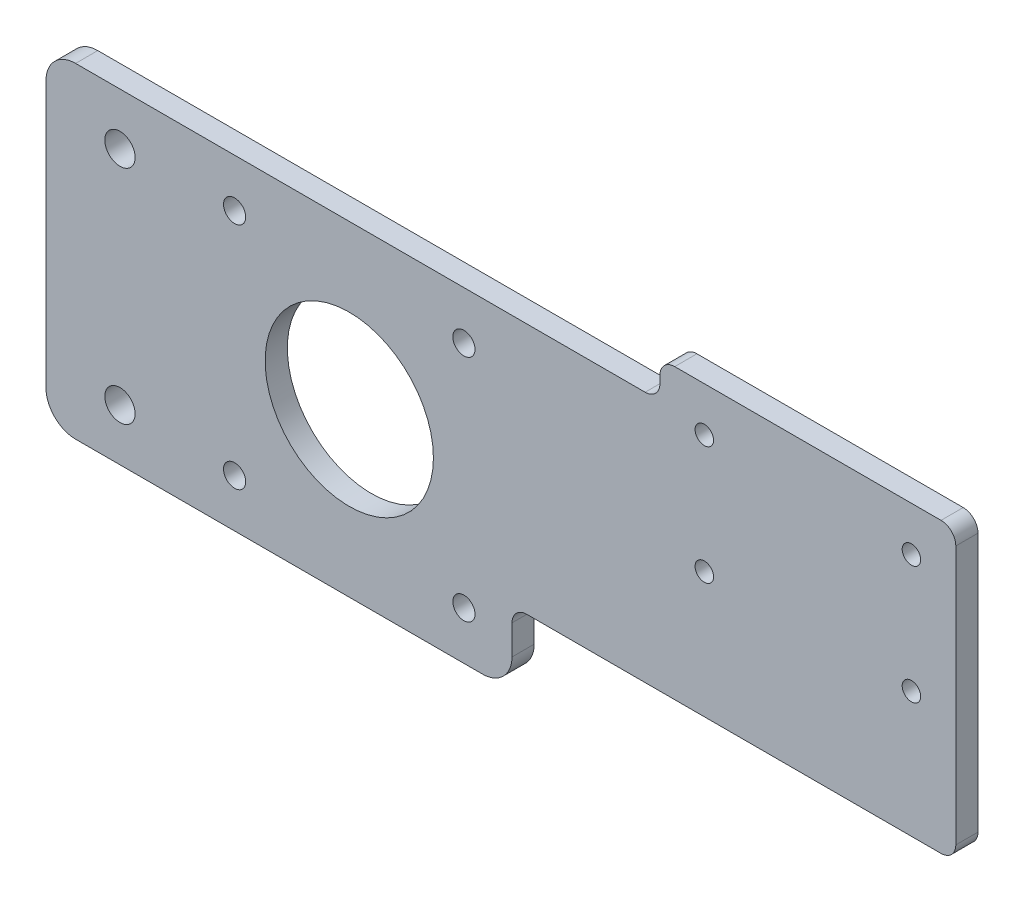
ISO-10303-21;
HEADER;
FILE_DESCRIPTION(('STEP AP214'),'2;1');
FILE_NAME('part.step','',(''),(''),'','','');
FILE_SCHEMA(('AUTOMOTIVE_DESIGN { 1 0 10303 214 1 1 1 1 }'));
ENDSEC;
DATA;
#1=APPLICATION_CONTEXT('core data for automotive mechanical design processes');
#2=APPLICATION_PROTOCOL_DEFINITION('international standard','automotive_design',2000,#1);
#3=PRODUCT_CONTEXT('',#1,'mechanical');
#4=PRODUCT('Part','Part','',(#3));
#5=PRODUCT_RELATED_PRODUCT_CATEGORY('part','',(#4));
#6=PRODUCT_DEFINITION_FORMATION('','',#4);
#7=PRODUCT_DEFINITION_CONTEXT('part definition',#1,'design');
#8=PRODUCT_DEFINITION('design','',#6,#7);
#9=PRODUCT_DEFINITION_SHAPE('','',#8);
#10=(LENGTH_UNIT() NAMED_UNIT(*) SI_UNIT(.MILLI.,.METRE.));
#11=(NAMED_UNIT(*) PLANE_ANGLE_UNIT() SI_UNIT($,.RADIAN.));
#12=(NAMED_UNIT(*) SI_UNIT($,.STERADIAN.) SOLID_ANGLE_UNIT());
#13=UNCERTAINTY_MEASURE_WITH_UNIT(LENGTH_MEASURE(1.E-05),#10,'distance_accuracy_value','');
#14=(GEOMETRIC_REPRESENTATION_CONTEXT(3) GLOBAL_UNCERTAINTY_ASSIGNED_CONTEXT((#13)) GLOBAL_UNIT_ASSIGNED_CONTEXT((#10,
#11,#12)) REPRESENTATION_CONTEXT('',''));
#15=CARTESIAN_POINT('',(0.,0.,0.));
#16=DIRECTION('',(0.,0.,1.));
#17=DIRECTION('',(1.,0.,0.));
#18=AXIS2_PLACEMENT_3D('',#15,#16,#17);
#19=CARTESIAN_POINT('',(31.5,22.,1.5));
#20=DIRECTION('',(-1.,0.,0.));
#21=DIRECTION('',(0.,0.,1.));
#22=AXIS2_PLACEMENT_3D('',#19,#20,#21);
#23=PLANE('',#22);
#24=DIRECTION('',(0.,1.,0.));
#25=VECTOR('',#24,1.);
#26=CARTESIAN_POINT('',(31.5,22.,-1.5));
#27=LINE('',#26,#25);
#28=CARTESIAN_POINT('',(31.5,-18.,-1.5));
#29=VERTEX_POINT('',#28);
#30=CARTESIAN_POINT('',(31.5,-14.,-1.5));
#31=VERTEX_POINT('',#30);
#32=EDGE_CURVE('E163',#29,#31,#27,.T.);
#33=ORIENTED_EDGE('',*,*,#32,.T.);
#34=DIRECTION('',(0.,0.,1.));
#35=VECTOR('',#34,1.);
#36=CARTESIAN_POINT('',(31.5,-14.,1.5));
#37=LINE('',#36,#35);
#38=CARTESIAN_POINT('',(31.5,-14.,1.5));
#39=VERTEX_POINT('',#38);
#40=EDGE_CURVE('E244',#31,#39,#37,.T.);
#41=ORIENTED_EDGE('',*,*,#40,.T.);
#42=DIRECTION('',(0.,1.,0.));
#43=VECTOR('',#42,1.);
#44=CARTESIAN_POINT('',(31.5,22.,1.5));
#45=LINE('',#44,#43);
#46=CARTESIAN_POINT('',(31.5,-18.,1.5));
#47=VERTEX_POINT('',#46);
#48=EDGE_CURVE('E166',#47,#39,#45,.T.);
#49=ORIENTED_EDGE('',*,*,#48,.F.);
#50=DIRECTION('',(0.,0.,-1.));
#51=VECTOR('',#50,1.);
#52=CARTESIAN_POINT('',(31.5,-18.,1.5));
#53=LINE('',#52,#51);
#54=EDGE_CURVE('E151',#47,#29,#53,.T.);
#55=ORIENTED_EDGE('',*,*,#54,.T.);
#56=EDGE_LOOP('',(#33,#41,#49,#55));
#57=FACE_BOUND('',#56,.T.);
#58=ADVANCED_FACE('F33',(#57),#23,.F.);
#59=CARTESIAN_POINT('',(-31.5,22.,1.5));
#60=DIRECTION('',(0.,-1.,0.));
#61=DIRECTION('',(0.,0.,-1.));
#62=AXIS2_PLACEMENT_3D('',#59,#60,#61);
#63=PLANE('',#62);
#64=DIRECTION('',(-1.,0.,0.));
#65=VECTOR('',#64,1.);
#66=CARTESIAN_POINT('',(-31.5,22.,1.5));
#67=LINE('',#66,#65);
#68=CARTESIAN_POINT('',(49.5,22.,1.5));
#69=VERTEX_POINT('',#68);
#70=CARTESIAN_POINT('',(-27.5,22.,1.5));
#71=VERTEX_POINT('',#70);
#72=EDGE_CURVE('E330',#69,#71,#67,.T.);
#73=ORIENTED_EDGE('',*,*,#72,.F.);
#74=DIRECTION('',(0.,0.,1.));
#75=VECTOR('',#74,1.);
#76=CARTESIAN_POINT('',(49.5,22.,1.5));
#77=LINE('',#76,#75);
#78=CARTESIAN_POINT('',(49.5,22.,-1.5));
#79=VERTEX_POINT('',#78);
#80=EDGE_CURVE('E238',#69,#79,#77,.F.);
#81=ORIENTED_EDGE('',*,*,#80,.T.);
#82=DIRECTION('',(-1.,0.,0.));
#83=VECTOR('',#82,1.);
#84=CARTESIAN_POINT('',(-31.5,22.,-1.5));
#85=LINE('',#84,#83);
#86=CARTESIAN_POINT('',(-27.5,22.,-1.5));
#87=VERTEX_POINT('',#86);
#88=EDGE_CURVE('E173',#79,#87,#85,.T.);
#89=ORIENTED_EDGE('',*,*,#88,.T.);
#90=DIRECTION('',(0.,0.,-1.));
#91=VECTOR('',#90,1.);
#92=CARTESIAN_POINT('',(-27.5,22.,1.5));
#93=LINE('',#92,#91);
#94=EDGE_CURVE('E204',#87,#71,#93,.F.);
#95=ORIENTED_EDGE('',*,*,#94,.T.);
#96=EDGE_LOOP('',(#73,#81,#89,#95));
#97=FACE_BOUND('',#96,.T.);
#98=ADVANCED_FACE('F268',(#97),#63,.F.);
#99=CARTESIAN_POINT('',(-31.5,22.,1.5));
#100=DIRECTION('',(1.,0.,0.));
#101=DIRECTION('',(0.,0.,-1.));
#102=AXIS2_PLACEMENT_3D('',#99,#100,#101);
#103=PLANE('',#102);
#104=DIRECTION('',(0.,-1.,0.));
#105=VECTOR('',#104,1.);
#106=CARTESIAN_POINT('',(-31.5,22.,-1.5));
#107=LINE('',#106,#105);
#108=CARTESIAN_POINT('',(-31.5,18.,-1.5));
#109=VERTEX_POINT('',#108);
#110=CARTESIAN_POINT('',(-31.5,-18.,-1.5));
#111=VERTEX_POINT('',#110);
#112=EDGE_CURVE('E176',#109,#111,#107,.T.);
#113=ORIENTED_EDGE('',*,*,#112,.T.);
#114=DIRECTION('',(0.,0.,-1.));
#115=VECTOR('',#114,1.);
#116=CARTESIAN_POINT('',(-31.5,-18.,1.5));
#117=LINE('',#116,#115);
#118=CARTESIAN_POINT('',(-31.5,-18.,1.5));
#119=VERTEX_POINT('',#118);
#120=EDGE_CURVE('E202',#111,#119,#117,.F.);
#121=ORIENTED_EDGE('',*,*,#120,.T.);
#122=DIRECTION('',(0.,-1.,0.));
#123=VECTOR('',#122,1.);
#124=CARTESIAN_POINT('',(-31.5,22.,1.5));
#125=LINE('',#124,#123);
#126=CARTESIAN_POINT('',(-31.5,18.,1.5));
#127=VERTEX_POINT('',#126);
#128=EDGE_CURVE('E331',#127,#119,#125,.T.);
#129=ORIENTED_EDGE('',*,*,#128,.F.);
#130=DIRECTION('',(0.,0.,-1.));
#131=VECTOR('',#130,1.);
#132=CARTESIAN_POINT('',(-31.5,18.,1.5));
#133=LINE('',#132,#131);
#134=EDGE_CURVE('E199',#127,#109,#133,.T.);
#135=ORIENTED_EDGE('',*,*,#134,.T.);
#136=EDGE_LOOP('',(#113,#121,#129,#135));
#137=FACE_BOUND('',#136,.T.);
#138=ADVANCED_FACE('F275',(#137),#103,.F.);
#139=CARTESIAN_POINT('',(-31.5,-22.,1.5));
#140=DIRECTION('',(0.,1.,0.));
#141=DIRECTION('',(0.,0.,1.));
#142=AXIS2_PLACEMENT_3D('',#139,#140,#141);
#143=PLANE('',#142);
#144=DIRECTION('',(1.,0.,0.));
#145=VECTOR('',#144,1.);
#146=CARTESIAN_POINT('',(-31.5,-22.,-1.5));
#147=LINE('',#146,#145);
#148=CARTESIAN_POINT('',(-27.5,-22.,-1.5));
#149=VERTEX_POINT('',#148);
#150=CARTESIAN_POINT('',(27.5,-22.,-1.5));
#151=VERTEX_POINT('',#150);
#152=EDGE_CURVE('E185',#149,#151,#147,.T.);
#153=ORIENTED_EDGE('',*,*,#152,.T.);
#154=DIRECTION('',(0.,0.,-1.));
#155=VECTOR('',#154,1.);
#156=CARTESIAN_POINT('',(27.5,-22.,1.5));
#157=LINE('',#156,#155);
#158=CARTESIAN_POINT('',(27.5,-22.,1.5));
#159=VERTEX_POINT('',#158);
#160=EDGE_CURVE('E152',#151,#159,#157,.F.);
#161=ORIENTED_EDGE('',*,*,#160,.T.);
#162=DIRECTION('',(1.,0.,0.));
#163=VECTOR('',#162,1.);
#164=CARTESIAN_POINT('',(-31.5,-22.,1.5));
#165=LINE('',#164,#163);
#166=CARTESIAN_POINT('',(-27.5,-22.,1.5));
#167=VERTEX_POINT('',#166);
#168=EDGE_CURVE('E168',#167,#159,#165,.T.);
#169=ORIENTED_EDGE('',*,*,#168,.F.);
#170=DIRECTION('',(0.,0.,-1.));
#171=VECTOR('',#170,1.);
#172=CARTESIAN_POINT('',(-27.5,-22.,1.5));
#173=LINE('',#172,#171);
#174=EDGE_CURVE('E156',#167,#149,#173,.T.);
#175=ORIENTED_EDGE('',*,*,#174,.T.);
#176=EDGE_LOOP('',(#153,#161,#169,#175));
#177=FACE_BOUND('',#176,.T.);
#178=ADVANCED_FACE('F339',(#177),#143,.F.);
#179=CARTESIAN_POINT('',(0.,0.,1.5));
#180=DIRECTION('',(0.,0.,1.));
#181=DIRECTION('',(1.,0.,0.));
#182=AXIS2_PLACEMENT_3D('',#179,#180,#181);
#183=PLANE('',#182);
#184=CARTESIAN_POINT('',(57.5,21.,1.5));
#185=DIRECTION('',(0.,0.,1.));
#186=DIRECTION('',(1.,0.,0.));
#187=AXIS2_PLACEMENT_3D('',#184,#185,#186);
#188=CIRCLE('',#187,1.25);
#189=CARTESIAN_POINT('',(58.75,21.,1.5));
#190=VERTEX_POINT('',#189);
#191=EDGE_CURVE('E418',#190,#190,#188,.T.);
#192=ORIENTED_EDGE('',*,*,#191,.F.);
#193=EDGE_LOOP('',(#192));
#194=FACE_BOUND('',#193,.T.);
#195=CARTESIAN_POINT('',(85.5,21.,1.5));
#196=DIRECTION('',(0.,0.,1.));
#197=DIRECTION('',(1.,0.,0.));
#198=AXIS2_PLACEMENT_3D('',#195,#196,#197);
#199=CIRCLE('',#198,1.25);
#200=CARTESIAN_POINT('',(86.75,21.,1.5));
#201=VERTEX_POINT('',#200);
#202=EDGE_CURVE('E412',#201,#201,#199,.T.);
#203=ORIENTED_EDGE('',*,*,#202,.F.);
#204=EDGE_LOOP('',(#203));
#205=FACE_BOUND('',#204,.T.);
#206=CARTESIAN_POINT('',(85.5,5.,1.5));
#207=DIRECTION('',(0.,0.,1.));
#208=DIRECTION('',(1.,0.,0.));
#209=AXIS2_PLACEMENT_3D('',#206,#207,#208);
#210=CIRCLE('',#209,1.25);
#211=CARTESIAN_POINT('',(86.75,5.,1.5));
#212=VERTEX_POINT('',#211);
#213=EDGE_CURVE('E406',#212,#212,#210,.T.);
#214=ORIENTED_EDGE('',*,*,#213,.F.);
#215=EDGE_LOOP('',(#214));
#216=FACE_BOUND('',#215,.T.);
#217=CARTESIAN_POINT('',(57.5,5.,1.5));
#218=DIRECTION('',(0.,0.,1.));
#219=DIRECTION('',(1.,0.,0.));
#220=AXIS2_PLACEMENT_3D('',#217,#218,#219);
#221=CIRCLE('',#220,1.25);
#222=CARTESIAN_POINT('',(58.75,5.,1.5));
#223=VERTEX_POINT('',#222);
#224=EDGE_CURVE('E212',#223,#223,#221,.T.);
#225=ORIENTED_EDGE('',*,*,#224,.F.);
#226=EDGE_LOOP('',(#225));
#227=FACE_BOUND('',#226,.T.);
#228=CARTESIAN_POINT('',(-21.5,-15.,1.5));
#229=DIRECTION('',(0.,0.,1.));
#230=DIRECTION('',(1.,0.,0.));
#231=AXIS2_PLACEMENT_3D('',#228,#229,#230);
#232=CIRCLE('',#231,2.04999999999999);
#233=CARTESIAN_POINT('',(-19.45,-15.,1.5));
#234=VERTEX_POINT('',#233);
#235=EDGE_CURVE('E211',#234,#234,#232,.T.);
#236=ORIENTED_EDGE('',*,*,#235,.F.);
#237=EDGE_LOOP('',(#236));
#238=FACE_BOUND('',#237,.T.);
#239=CARTESIAN_POINT('',(-21.5,15.,1.5));
#240=DIRECTION('',(0.,0.,1.));
#241=DIRECTION('',(1.,0.,0.));
#242=AXIS2_PLACEMENT_3D('',#239,#240,#241);
#243=CIRCLE('',#242,2.04999999999999);
#244=CARTESIAN_POINT('',(-19.45,15.,1.5));
#245=VERTEX_POINT('',#244);
#246=EDGE_CURVE('E372',#245,#245,#243,.T.);
#247=ORIENTED_EDGE('',*,*,#246,.F.);
#248=EDGE_LOOP('',(#247));
#249=FACE_BOUND('',#248,.T.);
#250=CARTESIAN_POINT('',(-6.00000000000001,-15.5,1.5));
#251=DIRECTION('',(0.,0.,1.));
#252=DIRECTION('',(1.,0.,0.));
#253=AXIS2_PLACEMENT_3D('',#250,#251,#252);
#254=CIRCLE('',#253,1.5);
#255=CARTESIAN_POINT('',(-4.50000000000001,-15.5,1.5));
#256=VERTEX_POINT('',#255);
#257=EDGE_CURVE('E378',#256,#256,#254,.T.);
#258=ORIENTED_EDGE('',*,*,#257,.F.);
#259=EDGE_LOOP('',(#258));
#260=FACE_BOUND('',#259,.T.);
#261=CARTESIAN_POINT('',(25.,-15.5,1.5));
#262=DIRECTION('',(0.,0.,1.));
#263=DIRECTION('',(1.,0.,0.));
#264=AXIS2_PLACEMENT_3D('',#261,#262,#263);
#265=CIRCLE('',#264,1.5);
#266=CARTESIAN_POINT('',(26.5,-15.5,1.5));
#267=VERTEX_POINT('',#266);
#268=EDGE_CURVE('E384',#267,#267,#265,.T.);
#269=ORIENTED_EDGE('',*,*,#268,.F.);
#270=EDGE_LOOP('',(#269));
#271=FACE_BOUND('',#270,.T.);
#272=CARTESIAN_POINT('',(25.,15.5,1.5));
#273=DIRECTION('',(0.,0.,1.));
#274=DIRECTION('',(1.,0.,0.));
#275=AXIS2_PLACEMENT_3D('',#272,#273,#274);
#276=CIRCLE('',#275,1.5);
#277=CARTESIAN_POINT('',(26.5,15.5,1.5));
#278=VERTEX_POINT('',#277);
#279=EDGE_CURVE('E390',#278,#278,#276,.T.);
#280=ORIENTED_EDGE('',*,*,#279,.F.);
#281=EDGE_LOOP('',(#280));
#282=FACE_BOUND('',#281,.T.);
#283=CARTESIAN_POINT('',(-6.00000000000001,15.5,1.5));
#284=DIRECTION('',(0.,0.,1.));
#285=DIRECTION('',(1.,0.,0.));
#286=AXIS2_PLACEMENT_3D('',#283,#284,#285);
#287=CIRCLE('',#286,1.5);
#288=CARTESIAN_POINT('',(-4.50000000000001,15.5,1.5));
#289=VERTEX_POINT('',#288);
#290=EDGE_CURVE('E396',#289,#289,#287,.T.);
#291=ORIENTED_EDGE('',*,*,#290,.F.);
#292=EDGE_LOOP('',(#291));
#293=FACE_BOUND('',#292,.T.);
#294=CARTESIAN_POINT('',(9.49999999999999,0.,1.5));
#295=DIRECTION('',(0.,0.,1.));
#296=DIRECTION('',(1.,0.,0.));
#297=AXIS2_PLACEMENT_3D('',#294,#295,#296);
#298=CIRCLE('',#297,11.375);
#299=CARTESIAN_POINT('',(20.875,0.,1.5));
#300=VERTEX_POINT('',#299);
#301=EDGE_CURVE('E361',#300,#300,#298,.T.);
#302=ORIENTED_EDGE('',*,*,#301,.F.);
#303=EDGE_LOOP('',(#302));
#304=FACE_BOUND('',#303,.T.);
#305=DIRECTION('',(0.,1.,0.));
#306=VECTOR('',#305,1.);
#307=CARTESIAN_POINT('',(91.5,-12.,1.5));
#308=LINE('',#307,#306);
#309=CARTESIAN_POINT('',(91.5,-10.,1.5));
#310=VERTEX_POINT('',#309);
#311=CARTESIAN_POINT('',(91.5,25.,1.5));
#312=VERTEX_POINT('',#311);
#313=EDGE_CURVE('E257',#310,#312,#308,.T.);
#314=ORIENTED_EDGE('',*,*,#313,.T.);
#315=CARTESIAN_POINT('',(89.5,25.,1.5));
#316=DIRECTION('',(0.,0.,1.));
#317=DIRECTION('',(1.,0.,0.));
#318=AXIS2_PLACEMENT_3D('',#315,#316,#317);
#319=CIRCLE('',#318,2.);
#320=CARTESIAN_POINT('',(89.5,27.,1.5));
#321=VERTEX_POINT('',#320);
#322=EDGE_CURVE('E221',#312,#321,#319,.T.);
#323=ORIENTED_EDGE('',*,*,#322,.T.);
#324=DIRECTION('',(-1.,0.,0.));
#325=VECTOR('',#324,1.);
#326=CARTESIAN_POINT('',(91.5,27.,1.5));
#327=LINE('',#326,#325);
#328=CARTESIAN_POINT('',(53.5,27.,1.5));
#329=VERTEX_POINT('',#328);
#330=EDGE_CURVE('E324',#321,#329,#327,.T.);
#331=ORIENTED_EDGE('',*,*,#330,.T.);
#332=CARTESIAN_POINT('',(53.5,25.,1.5));
#333=DIRECTION('',(0.,0.,1.));
#334=DIRECTION('',(1.,0.,0.));
#335=AXIS2_PLACEMENT_3D('',#332,#333,#334);
#336=CIRCLE('',#335,2.);
#337=CARTESIAN_POINT('',(51.5,25.,1.5));
#338=VERTEX_POINT('',#337);
#339=EDGE_CURVE('E219',#329,#338,#336,.T.);
#340=ORIENTED_EDGE('',*,*,#339,.T.);
#341=DIRECTION('',(0.,-1.,0.));
#342=VECTOR('',#341,1.);
#343=CARTESIAN_POINT('',(51.5,27.,1.5));
#344=LINE('',#343,#342);
#345=CARTESIAN_POINT('',(51.5,24.,1.5));
#346=VERTEX_POINT('',#345);
#347=EDGE_CURVE('E327',#338,#346,#344,.T.);
#348=ORIENTED_EDGE('',*,*,#347,.T.);
#349=CARTESIAN_POINT('',(49.5,24.,1.5));
#350=DIRECTION('',(0.,0.,1.));
#351=DIRECTION('',(1.,0.,0.));
#352=AXIS2_PLACEMENT_3D('',#349,#350,#351);
#353=CIRCLE('',#352,2.);
#354=EDGE_CURVE('E246',#346,#69,#353,.F.);
#355=ORIENTED_EDGE('',*,*,#354,.T.);
#356=ORIENTED_EDGE('',*,*,#72,.T.);
#357=CARTESIAN_POINT('',(-27.5,18.,1.5));
#358=DIRECTION('',(0.,0.,1.));
#359=DIRECTION('',(1.,0.,0.));
#360=AXIS2_PLACEMENT_3D('',#357,#358,#359);
#361=CIRCLE('',#360,4.);
#362=EDGE_CURVE('E193',#71,#127,#361,.T.);
#363=ORIENTED_EDGE('',*,*,#362,.T.);
#364=ORIENTED_EDGE('',*,*,#128,.T.);
#365=CARTESIAN_POINT('',(-27.5,-18.,1.5));
#366=DIRECTION('',(0.,0.,1.));
#367=DIRECTION('',(1.,0.,0.));
#368=AXIS2_PLACEMENT_3D('',#365,#366,#367);
#369=CIRCLE('',#368,4.);
#370=EDGE_CURVE('E195',#119,#167,#369,.T.);
#371=ORIENTED_EDGE('',*,*,#370,.T.);
#372=ORIENTED_EDGE('',*,*,#168,.T.);
#373=CARTESIAN_POINT('',(27.5,-18.,1.5));
#374=DIRECTION('',(0.,0.,1.));
#375=DIRECTION('',(1.,0.,0.));
#376=AXIS2_PLACEMENT_3D('',#373,#374,#375);
#377=CIRCLE('',#376,4.);
#378=EDGE_CURVE('E197',#159,#47,#377,.T.);
#379=ORIENTED_EDGE('',*,*,#378,.T.);
#380=ORIENTED_EDGE('',*,*,#48,.T.);
#381=CARTESIAN_POINT('',(33.5,-14.,1.5));
#382=DIRECTION('',(0.,0.,1.));
#383=DIRECTION('',(1.,0.,0.));
#384=AXIS2_PLACEMENT_3D('',#381,#382,#383);
#385=CIRCLE('',#384,2.);
#386=CARTESIAN_POINT('',(33.5,-12.,1.5));
#387=VERTEX_POINT('',#386);
#388=EDGE_CURVE('E41',#39,#387,#385,.F.);
#389=ORIENTED_EDGE('',*,*,#388,.T.);
#390=DIRECTION('',(1.,0.,0.));
#391=VECTOR('',#390,1.);
#392=CARTESIAN_POINT('',(31.5,-12.,1.5));
#393=LINE('',#392,#391);
#394=CARTESIAN_POINT('',(89.5,-12.,1.5));
#395=VERTEX_POINT('',#394);
#396=EDGE_CURVE('E253',#387,#395,#393,.T.);
#397=ORIENTED_EDGE('',*,*,#396,.T.);
#398=CARTESIAN_POINT('',(89.5,-10.,1.5));
#399=DIRECTION('',(0.,0.,1.));
#400=DIRECTION('',(1.,0.,0.));
#401=AXIS2_PLACEMENT_3D('',#398,#399,#400);
#402=CIRCLE('',#401,2.);
#403=EDGE_CURVE('E217',#395,#310,#402,.T.);
#404=ORIENTED_EDGE('',*,*,#403,.T.);
#405=EDGE_LOOP('',(#314,#323,#331,#340,#348,#355,#356,#363,#364,#371,#372,#379,#380,#389,#397,#404));
#406=FACE_BOUND('',#405,.T.);
#407=ADVANCED_FACE('F252',(#194,#205,#216,#227,#238,#249,#260,#271,#282,#293,#304,#406),#183,.T.);
#408=CARTESIAN_POINT('',(0.,0.,-1.5));
#409=DIRECTION('',(0.,0.,1.));
#410=DIRECTION('',(1.,0.,0.));
#411=AXIS2_PLACEMENT_3D('',#408,#409,#410);
#412=PLANE('',#411);
#413=CARTESIAN_POINT('',(57.5,21.,-1.5));
#414=DIRECTION('',(0.,0.,1.));
#415=DIRECTION('',(1.,0.,0.));
#416=AXIS2_PLACEMENT_3D('',#413,#414,#415);
#417=CIRCLE('',#416,1.25);
#418=CARTESIAN_POINT('',(58.75,21.,-1.5));
#419=VERTEX_POINT('',#418);
#420=EDGE_CURVE('E415',#419,#419,#417,.T.);
#421=ORIENTED_EDGE('',*,*,#420,.T.);
#422=EDGE_LOOP('',(#421));
#423=FACE_BOUND('',#422,.T.);
#424=CARTESIAN_POINT('',(85.5,21.,-1.5));
#425=DIRECTION('',(0.,0.,1.));
#426=DIRECTION('',(1.,0.,0.));
#427=AXIS2_PLACEMENT_3D('',#424,#425,#426);
#428=CIRCLE('',#427,1.25);
#429=CARTESIAN_POINT('',(86.75,21.,-1.5));
#430=VERTEX_POINT('',#429);
#431=EDGE_CURVE('E409',#430,#430,#428,.T.);
#432=ORIENTED_EDGE('',*,*,#431,.T.);
#433=EDGE_LOOP('',(#432));
#434=FACE_BOUND('',#433,.T.);
#435=CARTESIAN_POINT('',(85.5,5.,-1.5));
#436=DIRECTION('',(0.,0.,1.));
#437=DIRECTION('',(1.,0.,0.));
#438=AXIS2_PLACEMENT_3D('',#435,#436,#437);
#439=CIRCLE('',#438,1.25);
#440=CARTESIAN_POINT('',(86.75,5.,-1.5));
#441=VERTEX_POINT('',#440);
#442=EDGE_CURVE('E403',#441,#441,#439,.T.);
#443=ORIENTED_EDGE('',*,*,#442,.T.);
#444=EDGE_LOOP('',(#443));
#445=FACE_BOUND('',#444,.T.);
#446=CARTESIAN_POINT('',(57.5,5.,-1.5));
#447=DIRECTION('',(0.,0.,1.));
#448=DIRECTION('',(1.,0.,0.));
#449=AXIS2_PLACEMENT_3D('',#446,#447,#448);
#450=CIRCLE('',#449,1.25);
#451=CARTESIAN_POINT('',(58.75,5.,-1.5));
#452=VERTEX_POINT('',#451);
#453=EDGE_CURVE('E208',#452,#452,#450,.T.);
#454=ORIENTED_EDGE('',*,*,#453,.T.);
#455=EDGE_LOOP('',(#454));
#456=FACE_BOUND('',#455,.T.);
#457=CARTESIAN_POINT('',(-21.5,-15.,-1.5));
#458=DIRECTION('',(0.,0.,1.));
#459=DIRECTION('',(1.,0.,0.));
#460=AXIS2_PLACEMENT_3D('',#457,#458,#459);
#461=CIRCLE('',#460,2.04999999999999);
#462=CARTESIAN_POINT('',(-19.45,-15.,-1.5));
#463=VERTEX_POINT('',#462);
#464=EDGE_CURVE('E369',#463,#463,#461,.T.);
#465=ORIENTED_EDGE('',*,*,#464,.T.);
#466=EDGE_LOOP('',(#465));
#467=FACE_BOUND('',#466,.T.);
#468=CARTESIAN_POINT('',(-21.5,15.,-1.5));
#469=DIRECTION('',(0.,0.,1.));
#470=DIRECTION('',(1.,0.,0.));
#471=AXIS2_PLACEMENT_3D('',#468,#469,#470);
#472=CIRCLE('',#471,2.04999999999999);
#473=CARTESIAN_POINT('',(-19.45,15.,-1.5));
#474=VERTEX_POINT('',#473);
#475=EDGE_CURVE('E375',#474,#474,#472,.T.);
#476=ORIENTED_EDGE('',*,*,#475,.T.);
#477=EDGE_LOOP('',(#476));
#478=FACE_BOUND('',#477,.T.);
#479=CARTESIAN_POINT('',(-6.00000000000001,-15.5,-1.5));
#480=DIRECTION('',(0.,0.,1.));
#481=DIRECTION('',(1.,0.,0.));
#482=AXIS2_PLACEMENT_3D('',#479,#480,#481);
#483=CIRCLE('',#482,1.5);
#484=CARTESIAN_POINT('',(-4.50000000000001,-15.5,-1.5));
#485=VERTEX_POINT('',#484);
#486=EDGE_CURVE('E381',#485,#485,#483,.T.);
#487=ORIENTED_EDGE('',*,*,#486,.T.);
#488=EDGE_LOOP('',(#487));
#489=FACE_BOUND('',#488,.T.);
#490=CARTESIAN_POINT('',(25.,-15.5,-1.5));
#491=DIRECTION('',(0.,0.,1.));
#492=DIRECTION('',(1.,0.,0.));
#493=AXIS2_PLACEMENT_3D('',#490,#491,#492);
#494=CIRCLE('',#493,1.5);
#495=CARTESIAN_POINT('',(26.5,-15.5,-1.5));
#496=VERTEX_POINT('',#495);
#497=EDGE_CURVE('E387',#496,#496,#494,.T.);
#498=ORIENTED_EDGE('',*,*,#497,.T.);
#499=EDGE_LOOP('',(#498));
#500=FACE_BOUND('',#499,.T.);
#501=CARTESIAN_POINT('',(25.,15.5,-1.5));
#502=DIRECTION('',(0.,0.,1.));
#503=DIRECTION('',(1.,0.,0.));
#504=AXIS2_PLACEMENT_3D('',#501,#502,#503);
#505=CIRCLE('',#504,1.5);
#506=CARTESIAN_POINT('',(26.5,15.5,-1.5));
#507=VERTEX_POINT('',#506);
#508=EDGE_CURVE('E393',#507,#507,#505,.T.);
#509=ORIENTED_EDGE('',*,*,#508,.T.);
#510=EDGE_LOOP('',(#509));
#511=FACE_BOUND('',#510,.T.);
#512=CARTESIAN_POINT('',(-6.00000000000001,15.5,-1.5));
#513=DIRECTION('',(0.,0.,1.));
#514=DIRECTION('',(1.,0.,0.));
#515=AXIS2_PLACEMENT_3D('',#512,#513,#514);
#516=CIRCLE('',#515,1.5);
#517=CARTESIAN_POINT('',(-4.50000000000001,15.5,-1.5));
#518=VERTEX_POINT('',#517);
#519=EDGE_CURVE('E364',#518,#518,#516,.T.);
#520=ORIENTED_EDGE('',*,*,#519,.T.);
#521=EDGE_LOOP('',(#520));
#522=FACE_BOUND('',#521,.T.);
#523=CARTESIAN_POINT('',(9.49999999999999,0.,-1.5));
#524=DIRECTION('',(0.,0.,1.));
#525=DIRECTION('',(1.,0.,0.));
#526=AXIS2_PLACEMENT_3D('',#523,#524,#525);
#527=CIRCLE('',#526,11.375);
#528=CARTESIAN_POINT('',(20.875,0.,-1.5));
#529=VERTEX_POINT('',#528);
#530=EDGE_CURVE('E258',#529,#529,#527,.T.);
#531=ORIENTED_EDGE('',*,*,#530,.T.);
#532=EDGE_LOOP('',(#531));
#533=FACE_BOUND('',#532,.T.);
#534=DIRECTION('',(1.,0.,0.));
#535=VECTOR('',#534,1.);
#536=CARTESIAN_POINT('',(91.5,27.,-1.5));
#537=LINE('',#536,#535);
#538=CARTESIAN_POINT('',(53.5,27.,-1.5));
#539=VERTEX_POINT('',#538);
#540=CARTESIAN_POINT('',(89.5,27.,-1.5));
#541=VERTEX_POINT('',#540);
#542=EDGE_CURVE('E317',#539,#541,#537,.T.);
#543=ORIENTED_EDGE('',*,*,#542,.T.);
#544=CARTESIAN_POINT('',(89.5,25.,-1.5));
#545=DIRECTION('',(0.,0.,1.));
#546=DIRECTION('',(1.,0.,0.));
#547=AXIS2_PLACEMENT_3D('',#544,#545,#546);
#548=CIRCLE('',#547,2.);
#549=CARTESIAN_POINT('',(91.5,25.,-1.5));
#550=VERTEX_POINT('',#549);
#551=EDGE_CURVE('E231',#541,#550,#548,.F.);
#552=ORIENTED_EDGE('',*,*,#551,.T.);
#553=DIRECTION('',(0.,-1.,0.));
#554=VECTOR('',#553,1.);
#555=CARTESIAN_POINT('',(91.5,-12.,-1.5));
#556=LINE('',#555,#554);
#557=CARTESIAN_POINT('',(91.5,-10.,-1.5));
#558=VERTEX_POINT('',#557);
#559=EDGE_CURVE('E319',#550,#558,#556,.T.);
#560=ORIENTED_EDGE('',*,*,#559,.T.);
#561=CARTESIAN_POINT('',(89.5,-10.,-1.5));
#562=DIRECTION('',(0.,0.,1.));
#563=DIRECTION('',(1.,0.,0.));
#564=AXIS2_PLACEMENT_3D('',#561,#562,#563);
#565=CIRCLE('',#564,2.);
#566=CARTESIAN_POINT('',(89.5,-12.,-1.5));
#567=VERTEX_POINT('',#566);
#568=EDGE_CURVE('E55',#558,#567,#565,.F.);
#569=ORIENTED_EDGE('',*,*,#568,.T.);
#570=DIRECTION('',(-1.,0.,0.));
#571=VECTOR('',#570,1.);
#572=CARTESIAN_POINT('',(31.5,-12.,-1.5));
#573=LINE('',#572,#571);
#574=CARTESIAN_POINT('',(33.5,-12.,-1.5));
#575=VERTEX_POINT('',#574);
#576=EDGE_CURVE('E174',#567,#575,#573,.T.);
#577=ORIENTED_EDGE('',*,*,#576,.T.);
#578=CARTESIAN_POINT('',(33.5,-14.,-1.5));
#579=DIRECTION('',(0.,0.,1.));
#580=DIRECTION('',(1.,0.,0.));
#581=AXIS2_PLACEMENT_3D('',#578,#579,#580);
#582=CIRCLE('',#581,2.);
#583=EDGE_CURVE('E11',#575,#31,#582,.T.);
#584=ORIENTED_EDGE('',*,*,#583,.T.);
#585=ORIENTED_EDGE('',*,*,#32,.F.);
#586=CARTESIAN_POINT('',(27.5,-18.,-1.5));
#587=DIRECTION('',(0.,0.,1.));
#588=DIRECTION('',(1.,0.,0.));
#589=AXIS2_PLACEMENT_3D('',#586,#587,#588);
#590=CIRCLE('',#589,4.);
#591=EDGE_CURVE('E147',#29,#151,#590,.F.);
#592=ORIENTED_EDGE('',*,*,#591,.T.);
#593=ORIENTED_EDGE('',*,*,#152,.F.);
#594=CARTESIAN_POINT('',(-27.5,-18.,-1.5));
#595=DIRECTION('',(0.,0.,1.));
#596=DIRECTION('',(1.,0.,0.));
#597=AXIS2_PLACEMENT_3D('',#594,#595,#596);
#598=CIRCLE('',#597,4.);
#599=EDGE_CURVE('E157',#149,#111,#598,.F.);
#600=ORIENTED_EDGE('',*,*,#599,.T.);
#601=ORIENTED_EDGE('',*,*,#112,.F.);
#602=CARTESIAN_POINT('',(-27.5,18.,-1.5));
#603=DIRECTION('',(0.,0.,1.));
#604=DIRECTION('',(1.,0.,0.));
#605=AXIS2_PLACEMENT_3D('',#602,#603,#604);
#606=CIRCLE('',#605,4.);
#607=EDGE_CURVE('E167',#109,#87,#606,.F.);
#608=ORIENTED_EDGE('',*,*,#607,.T.);
#609=ORIENTED_EDGE('',*,*,#88,.F.);
#610=CARTESIAN_POINT('',(49.5,24.,-1.5));
#611=DIRECTION('',(0.,0.,1.));
#612=DIRECTION('',(1.,0.,0.));
#613=AXIS2_PLACEMENT_3D('',#610,#611,#612);
#614=CIRCLE('',#613,2.);
#615=CARTESIAN_POINT('',(51.5,24.,-1.5));
#616=VERTEX_POINT('',#615);
#617=EDGE_CURVE('E248',#79,#616,#614,.T.);
#618=ORIENTED_EDGE('',*,*,#617,.T.);
#619=DIRECTION('',(0.,1.,0.));
#620=VECTOR('',#619,1.);
#621=CARTESIAN_POINT('',(51.5,27.,-1.5));
#622=LINE('',#621,#620);
#623=CARTESIAN_POINT('',(51.5,25.,-1.5));
#624=VERTEX_POINT('',#623);
#625=EDGE_CURVE('E178',#616,#624,#622,.T.);
#626=ORIENTED_EDGE('',*,*,#625,.T.);
#627=CARTESIAN_POINT('',(53.5,25.,-1.5));
#628=DIRECTION('',(0.,0.,1.));
#629=DIRECTION('',(1.,0.,0.));
#630=AXIS2_PLACEMENT_3D('',#627,#628,#629);
#631=CIRCLE('',#630,2.);
#632=EDGE_CURVE('E229',#624,#539,#631,.F.);
#633=ORIENTED_EDGE('',*,*,#632,.T.);
#634=EDGE_LOOP('',(#543,#552,#560,#569,#577,#584,#585,#592,#593,#600,#601,#608,#609,#618,#626,#633));
#635=FACE_BOUND('',#634,.T.);
#636=ADVANCED_FACE('F171',(#423,#434,#445,#456,#467,#478,#489,#500,#511,#522,#533,#635),#412,.F.);
#637=CARTESIAN_POINT('',(51.5,27.,-73.0611626512594));
#638=DIRECTION('',(-1.,0.,0.));
#639=DIRECTION('',(0.,-1.,0.));
#640=AXIS2_PLACEMENT_3D('',#637,#638,#639);
#641=PLANE('',#640);
#642=ORIENTED_EDGE('',*,*,#347,.F.);
#643=DIRECTION('',(0.,0.,1.));
#644=VECTOR('',#643,1.);
#645=CARTESIAN_POINT('',(51.5,25.,-73.0611626512594));
#646=LINE('',#645,#644);
#647=EDGE_CURVE('E236',#338,#624,#646,.F.);
#648=ORIENTED_EDGE('',*,*,#647,.T.);
#649=ORIENTED_EDGE('',*,*,#625,.F.);
#650=DIRECTION('',(0.,0.,1.));
#651=VECTOR('',#650,1.);
#652=CARTESIAN_POINT('',(51.5,24.,-73.0611626512594));
#653=LINE('',#652,#651);
#654=EDGE_CURVE('E233',#616,#346,#653,.T.);
#655=ORIENTED_EDGE('',*,*,#654,.T.);
#656=EDGE_LOOP('',(#642,#648,#649,#655));
#657=FACE_BOUND('',#656,.T.);
#658=ADVANCED_FACE('F314',(#657),#641,.T.);
#659=CARTESIAN_POINT('',(91.5,27.,-73.0611626512594));
#660=DIRECTION('',(0.,1.,0.));
#661=DIRECTION('',(-1.,0.,0.));
#662=AXIS2_PLACEMENT_3D('',#659,#660,#661);
#663=PLANE('',#662);
#664=ORIENTED_EDGE('',*,*,#330,.F.);
#665=DIRECTION('',(0.,0.,1.));
#666=VECTOR('',#665,1.);
#667=CARTESIAN_POINT('',(89.5,27.,-73.0611626512594));
#668=LINE('',#667,#666);
#669=EDGE_CURVE('E226',#321,#541,#668,.F.);
#670=ORIENTED_EDGE('',*,*,#669,.T.);
#671=ORIENTED_EDGE('',*,*,#542,.F.);
#672=DIRECTION('',(0.,0.,1.));
#673=VECTOR('',#672,1.);
#674=CARTESIAN_POINT('',(53.5,27.,-73.0611626512594));
#675=LINE('',#674,#673);
#676=EDGE_CURVE('E223',#539,#329,#675,.T.);
#677=ORIENTED_EDGE('',*,*,#676,.T.);
#678=EDGE_LOOP('',(#664,#670,#671,#677));
#679=FACE_BOUND('',#678,.T.);
#680=ADVANCED_FACE('F352',(#679),#663,.T.);
#681=CARTESIAN_POINT('',(91.5,-12.,-73.0611626512594));
#682=DIRECTION('',(1.,0.,0.));
#683=DIRECTION('',(0.,0.,-1.));
#684=AXIS2_PLACEMENT_3D('',#681,#682,#683);
#685=PLANE('',#684);
#686=ORIENTED_EDGE('',*,*,#559,.F.);
#687=DIRECTION('',(0.,0.,1.));
#688=VECTOR('',#687,1.);
#689=CARTESIAN_POINT('',(91.5,25.,-73.0611626512594));
#690=LINE('',#689,#688);
#691=EDGE_CURVE('E214',#550,#312,#690,.T.);
#692=ORIENTED_EDGE('',*,*,#691,.T.);
#693=ORIENTED_EDGE('',*,*,#313,.F.);
#694=DIRECTION('',(0.,0.,1.));
#695=VECTOR('',#694,1.);
#696=CARTESIAN_POINT('',(91.5,-10.,-73.0611626512594));
#697=LINE('',#696,#695);
#698=EDGE_CURVE('E207',#310,#558,#697,.F.);
#699=ORIENTED_EDGE('',*,*,#698,.T.);
#700=EDGE_LOOP('',(#686,#692,#693,#699));
#701=FACE_BOUND('',#700,.T.);
#702=ADVANCED_FACE('F357',(#701),#685,.T.);
#703=CARTESIAN_POINT('',(31.5,-12.,-73.0611626512594));
#704=DIRECTION('',(0.,-1.,0.));
#705=DIRECTION('',(0.,0.,-1.));
#706=AXIS2_PLACEMENT_3D('',#703,#704,#705);
#707=PLANE('',#706);
#708=ORIENTED_EDGE('',*,*,#576,.F.);
#709=DIRECTION('',(0.,0.,1.));
#710=VECTOR('',#709,1.);
#711=CARTESIAN_POINT('',(89.5,-12.,-73.0611626512594));
#712=LINE('',#711,#710);
#713=EDGE_CURVE('E241',#567,#395,#712,.T.);
#714=ORIENTED_EDGE('',*,*,#713,.T.);
#715=ORIENTED_EDGE('',*,*,#396,.F.);
#716=DIRECTION('',(0.,0.,1.));
#717=VECTOR('',#716,1.);
#718=CARTESIAN_POINT('',(33.5,-12.,-73.0611626512594));
#719=LINE('',#718,#717);
#720=EDGE_CURVE('E48',#387,#575,#719,.F.);
#721=ORIENTED_EDGE('',*,*,#720,.T.);
#722=EDGE_LOOP('',(#708,#714,#715,#721));
#723=FACE_BOUND('',#722,.T.);
#724=ADVANCED_FACE('F255',(#723),#707,.T.);
#725=CARTESIAN_POINT('',(9.49999999999999,0.,-1.5));
#726=DIRECTION('',(0.,0.,1.));
#727=DIRECTION('',(1.,0.,0.));
#728=AXIS2_PLACEMENT_3D('',#725,#726,#727);
#729=CYLINDRICAL_SURFACE('',#728,11.375);
#730=ORIENTED_EDGE('',*,*,#530,.F.);
#731=EDGE_LOOP('',(#730));
#732=FACE_BOUND('',#731,.T.);
#733=ORIENTED_EDGE('',*,*,#301,.T.);
#734=EDGE_LOOP('',(#733));
#735=FACE_BOUND('',#734,.T.);
#736=ADVANCED_FACE('F447',(#732,#735),#729,.F.);
#737=CARTESIAN_POINT('',(-6.00000000000001,15.5,-1.5));
#738=DIRECTION('',(0.,0.,1.));
#739=DIRECTION('',(1.,0.,0.));
#740=AXIS2_PLACEMENT_3D('',#737,#738,#739);
#741=CYLINDRICAL_SURFACE('',#740,1.5);
#742=ORIENTED_EDGE('',*,*,#519,.F.);
#743=EDGE_LOOP('',(#742));
#744=FACE_BOUND('',#743,.T.);
#745=ORIENTED_EDGE('',*,*,#290,.T.);
#746=EDGE_LOOP('',(#745));
#747=FACE_BOUND('',#746,.T.);
#748=ADVANCED_FACE('F449',(#744,#747),#741,.F.);
#749=CARTESIAN_POINT('',(25.,15.5,-1.5));
#750=DIRECTION('',(0.,0.,1.));
#751=DIRECTION('',(1.,0.,0.));
#752=AXIS2_PLACEMENT_3D('',#749,#750,#751);
#753=CYLINDRICAL_SURFACE('',#752,1.5);
#754=ORIENTED_EDGE('',*,*,#508,.F.);
#755=EDGE_LOOP('',(#754));
#756=FACE_BOUND('',#755,.T.);
#757=ORIENTED_EDGE('',*,*,#279,.T.);
#758=EDGE_LOOP('',(#757));
#759=FACE_BOUND('',#758,.T.);
#760=ADVANCED_FACE('F456',(#756,#759),#753,.F.);
#761=CARTESIAN_POINT('',(25.,-15.5,-1.5));
#762=DIRECTION('',(0.,0.,1.));
#763=DIRECTION('',(1.,0.,0.));
#764=AXIS2_PLACEMENT_3D('',#761,#762,#763);
#765=CYLINDRICAL_SURFACE('',#764,1.5);
#766=ORIENTED_EDGE('',*,*,#497,.F.);
#767=EDGE_LOOP('',(#766));
#768=FACE_BOUND('',#767,.T.);
#769=ORIENTED_EDGE('',*,*,#268,.T.);
#770=EDGE_LOOP('',(#769));
#771=FACE_BOUND('',#770,.T.);
#772=ADVANCED_FACE('F641',(#768,#771),#765,.F.);
#773=CARTESIAN_POINT('',(-6.00000000000001,-15.5,-1.5));
#774=DIRECTION('',(0.,0.,1.));
#775=DIRECTION('',(1.,0.,0.));
#776=AXIS2_PLACEMENT_3D('',#773,#774,#775);
#777=CYLINDRICAL_SURFACE('',#776,1.5);
#778=ORIENTED_EDGE('',*,*,#486,.F.);
#779=EDGE_LOOP('',(#778));
#780=FACE_BOUND('',#779,.T.);
#781=ORIENTED_EDGE('',*,*,#257,.T.);
#782=EDGE_LOOP('',(#781));
#783=FACE_BOUND('',#782,.T.);
#784=ADVANCED_FACE('F650',(#780,#783),#777,.F.);
#785=CARTESIAN_POINT('',(-21.5,15.,-1.5));
#786=DIRECTION('',(0.,0.,1.));
#787=DIRECTION('',(1.,0.,0.));
#788=AXIS2_PLACEMENT_3D('',#785,#786,#787);
#789=CYLINDRICAL_SURFACE('',#788,2.04999999999999);
#790=ORIENTED_EDGE('',*,*,#475,.F.);
#791=EDGE_LOOP('',(#790));
#792=FACE_BOUND('',#791,.T.);
#793=ORIENTED_EDGE('',*,*,#246,.T.);
#794=EDGE_LOOP('',(#793));
#795=FACE_BOUND('',#794,.T.);
#796=ADVANCED_FACE('F659',(#792,#795),#789,.F.);
#797=CARTESIAN_POINT('',(-21.5,-15.,-1.5));
#798=DIRECTION('',(0.,0.,1.));
#799=DIRECTION('',(1.,0.,0.));
#800=AXIS2_PLACEMENT_3D('',#797,#798,#799);
#801=CYLINDRICAL_SURFACE('',#800,2.04999999999999);
#802=ORIENTED_EDGE('',*,*,#464,.F.);
#803=EDGE_LOOP('',(#802));
#804=FACE_BOUND('',#803,.T.);
#805=ORIENTED_EDGE('',*,*,#235,.T.);
#806=EDGE_LOOP('',(#805));
#807=FACE_BOUND('',#806,.T.);
#808=ADVANCED_FACE('F283',(#804,#807),#801,.F.);
#809=CARTESIAN_POINT('',(27.5,-18.,1.5));
#810=DIRECTION('',(0.,0.,-1.));
#811=DIRECTION('',(-1.,0.,0.));
#812=AXIS2_PLACEMENT_3D('',#809,#810,#811);
#813=CYLINDRICAL_SURFACE('',#812,4.);
#814=ORIENTED_EDGE('',*,*,#378,.F.);
#815=ORIENTED_EDGE('',*,*,#160,.F.);
#816=ORIENTED_EDGE('',*,*,#591,.F.);
#817=ORIENTED_EDGE('',*,*,#54,.F.);
#818=EDGE_LOOP('',(#814,#815,#816,#817));
#819=FACE_BOUND('',#818,.T.);
#820=ADVANCED_FACE('F150',(#819),#813,.T.);
#821=CARTESIAN_POINT('',(-27.5,-18.,1.5));
#822=DIRECTION('',(0.,0.,-1.));
#823=DIRECTION('',(-1.,0.,0.));
#824=AXIS2_PLACEMENT_3D('',#821,#822,#823);
#825=CYLINDRICAL_SURFACE('',#824,4.);
#826=ORIENTED_EDGE('',*,*,#370,.F.);
#827=ORIENTED_EDGE('',*,*,#120,.F.);
#828=ORIENTED_EDGE('',*,*,#599,.F.);
#829=ORIENTED_EDGE('',*,*,#174,.F.);
#830=EDGE_LOOP('',(#826,#827,#828,#829));
#831=FACE_BOUND('',#830,.T.);
#832=ADVANCED_FACE('F282',(#831),#825,.T.);
#833=CARTESIAN_POINT('',(-27.5,18.,1.5));
#834=DIRECTION('',(0.,0.,-1.));
#835=DIRECTION('',(-1.,0.,0.));
#836=AXIS2_PLACEMENT_3D('',#833,#834,#835);
#837=CYLINDRICAL_SURFACE('',#836,4.);
#838=ORIENTED_EDGE('',*,*,#362,.F.);
#839=ORIENTED_EDGE('',*,*,#94,.F.);
#840=ORIENTED_EDGE('',*,*,#607,.F.);
#841=ORIENTED_EDGE('',*,*,#134,.F.);
#842=EDGE_LOOP('',(#838,#839,#840,#841));
#843=FACE_BOUND('',#842,.T.);
#844=ADVANCED_FACE('F286',(#843),#837,.T.);
#845=CARTESIAN_POINT('',(57.5,5.,1.5));
#846=DIRECTION('',(0.,0.,1.));
#847=DIRECTION('',(1.,0.,0.));
#848=AXIS2_PLACEMENT_3D('',#845,#846,#847);
#849=CYLINDRICAL_SURFACE('',#848,1.25);
#850=ORIENTED_EDGE('',*,*,#224,.T.);
#851=EDGE_LOOP('',(#850));
#852=FACE_BOUND('',#851,.T.);
#853=ORIENTED_EDGE('',*,*,#453,.F.);
#854=EDGE_LOOP('',(#853));
#855=FACE_BOUND('',#854,.T.);
#856=ADVANCED_FACE('F290',(#852,#855),#849,.F.);
#857=CARTESIAN_POINT('',(85.5,5.,1.5));
#858=DIRECTION('',(0.,0.,1.));
#859=DIRECTION('',(1.,0.,0.));
#860=AXIS2_PLACEMENT_3D('',#857,#858,#859);
#861=CYLINDRICAL_SURFACE('',#860,1.25);
#862=ORIENTED_EDGE('',*,*,#213,.T.);
#863=EDGE_LOOP('',(#862));
#864=FACE_BOUND('',#863,.T.);
#865=ORIENTED_EDGE('',*,*,#442,.F.);
#866=EDGE_LOOP('',(#865));
#867=FACE_BOUND('',#866,.T.);
#868=ADVANCED_FACE('F511',(#864,#867),#861,.F.);
#869=CARTESIAN_POINT('',(85.5,21.,1.5));
#870=DIRECTION('',(0.,0.,1.));
#871=DIRECTION('',(1.,0.,0.));
#872=AXIS2_PLACEMENT_3D('',#869,#870,#871);
#873=CYLINDRICAL_SURFACE('',#872,1.25);
#874=ORIENTED_EDGE('',*,*,#202,.T.);
#875=EDGE_LOOP('',(#874));
#876=FACE_BOUND('',#875,.T.);
#877=ORIENTED_EDGE('',*,*,#431,.F.);
#878=EDGE_LOOP('',(#877));
#879=FACE_BOUND('',#878,.T.);
#880=ADVANCED_FACE('F521',(#876,#879),#873,.F.);
#881=CARTESIAN_POINT('',(57.5,21.,1.5));
#882=DIRECTION('',(0.,0.,1.));
#883=DIRECTION('',(1.,0.,0.));
#884=AXIS2_PLACEMENT_3D('',#881,#882,#883);
#885=CYLINDRICAL_SURFACE('',#884,1.25);
#886=ORIENTED_EDGE('',*,*,#191,.T.);
#887=EDGE_LOOP('',(#886));
#888=FACE_BOUND('',#887,.T.);
#889=ORIENTED_EDGE('',*,*,#420,.F.);
#890=EDGE_LOOP('',(#889));
#891=FACE_BOUND('',#890,.T.);
#892=ADVANCED_FACE('F296',(#888,#891),#885,.F.);
#893=CARTESIAN_POINT('',(89.5,25.,-73.0611626512594));
#894=DIRECTION('',(0.,0.,1.));
#895=DIRECTION('',(1.,0.,0.));
#896=AXIS2_PLACEMENT_3D('',#893,#894,#895);
#897=CYLINDRICAL_SURFACE('',#896,2.);
#898=ORIENTED_EDGE('',*,*,#551,.F.);
#899=ORIENTED_EDGE('',*,*,#669,.F.);
#900=ORIENTED_EDGE('',*,*,#322,.F.);
#901=ORIENTED_EDGE('',*,*,#691,.F.);
#902=EDGE_LOOP('',(#898,#899,#900,#901));
#903=FACE_BOUND('',#902,.T.);
#904=ADVANCED_FACE('F292',(#903),#897,.T.);
#905=CARTESIAN_POINT('',(53.5,25.,-73.0611626512594));
#906=DIRECTION('',(0.,0.,1.));
#907=DIRECTION('',(1.,0.,0.));
#908=AXIS2_PLACEMENT_3D('',#905,#906,#907);
#909=CYLINDRICAL_SURFACE('',#908,2.);
#910=ORIENTED_EDGE('',*,*,#632,.F.);
#911=ORIENTED_EDGE('',*,*,#647,.F.);
#912=ORIENTED_EDGE('',*,*,#339,.F.);
#913=ORIENTED_EDGE('',*,*,#676,.F.);
#914=EDGE_LOOP('',(#910,#911,#912,#913));
#915=FACE_BOUND('',#914,.T.);
#916=ADVANCED_FACE('F295',(#915),#909,.T.);
#917=CARTESIAN_POINT('',(49.5,24.,-73.0611626512594));
#918=DIRECTION('',(0.,0.,1.));
#919=DIRECTION('',(1.,0.,0.));
#920=AXIS2_PLACEMENT_3D('',#917,#918,#919);
#921=CYLINDRICAL_SURFACE('',#920,2.);
#922=ORIENTED_EDGE('',*,*,#617,.F.);
#923=ORIENTED_EDGE('',*,*,#80,.F.);
#924=ORIENTED_EDGE('',*,*,#354,.F.);
#925=ORIENTED_EDGE('',*,*,#654,.F.);
#926=EDGE_LOOP('',(#922,#923,#924,#925));
#927=FACE_BOUND('',#926,.T.);
#928=ADVANCED_FACE('F265',(#927),#921,.F.);
#929=CARTESIAN_POINT('',(89.5,-10.,-73.0611626512594));
#930=DIRECTION('',(0.,0.,1.));
#931=DIRECTION('',(1.,0.,0.));
#932=AXIS2_PLACEMENT_3D('',#929,#930,#931);
#933=CYLINDRICAL_SURFACE('',#932,2.);
#934=ORIENTED_EDGE('',*,*,#568,.F.);
#935=ORIENTED_EDGE('',*,*,#698,.F.);
#936=ORIENTED_EDGE('',*,*,#403,.F.);
#937=ORIENTED_EDGE('',*,*,#713,.F.);
#938=EDGE_LOOP('',(#934,#935,#936,#937));
#939=FACE_BOUND('',#938,.T.);
#940=ADVANCED_FACE('F261',(#939),#933,.T.);
#941=CARTESIAN_POINT('',(33.5,-14.,1.5));
#942=DIRECTION('',(0.,0.,1.));
#943=DIRECTION('',(1.,0.,0.));
#944=AXIS2_PLACEMENT_3D('',#941,#942,#943);
#945=CYLINDRICAL_SURFACE('',#944,2.);
#946=ORIENTED_EDGE('',*,*,#583,.F.);
#947=ORIENTED_EDGE('',*,*,#720,.F.);
#948=ORIENTED_EDGE('',*,*,#388,.F.);
#949=ORIENTED_EDGE('',*,*,#40,.F.);
#950=EDGE_LOOP('',(#946,#947,#948,#949));
#951=FACE_BOUND('',#950,.T.);
#952=ADVANCED_FACE('F35',(#951),#945,.F.);
#953=CLOSED_SHELL('',(#58,#98,#138,#178,#407,#636,#658,#680,#702,#724,#736,#748,#760,#772,#784,
#796,#808,#820,#832,#844,#856,#868,#880,#892,#904,#916,#928,#940,#952));
#954=MANIFOLD_SOLID_BREP('B2',#953);
#955=ADVANCED_BREP_SHAPE_REPRESENTATION('',(#18,#954),#14);
#956=SHAPE_DEFINITION_REPRESENTATION(#9,#955);
ENDSEC;
END-ISO-10303-21;
